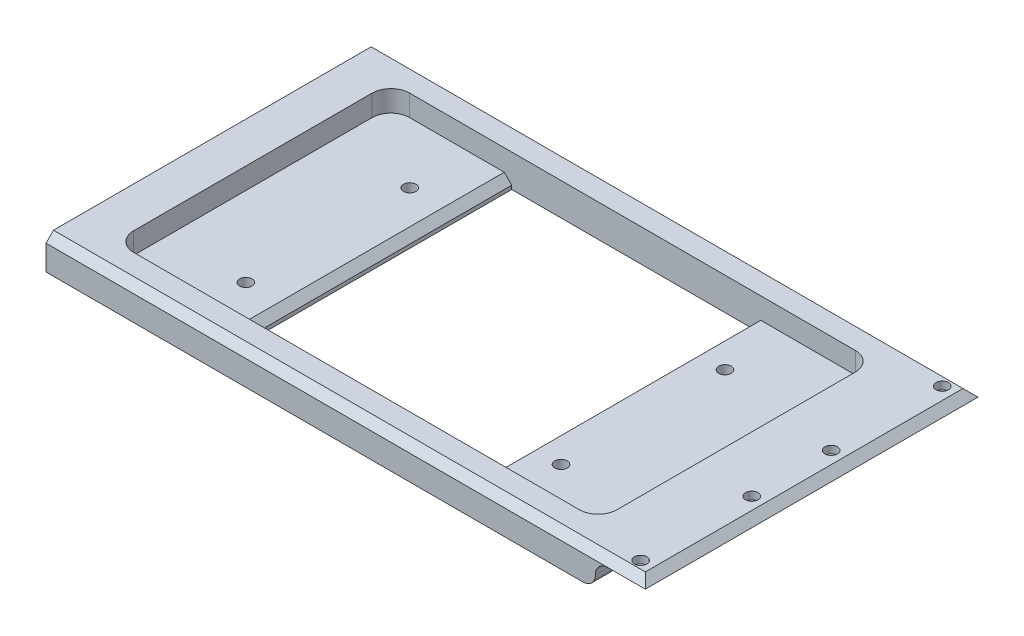
ISO-10303-21;
HEADER;
FILE_DESCRIPTION(('STEP AP214'),'2;1');
FILE_NAME('part.step','',(''),(''),'','','');
FILE_SCHEMA(('AUTOMOTIVE_DESIGN { 1 0 10303 214 1 1 1 1 }'));
ENDSEC;
DATA;
#1=APPLICATION_CONTEXT('core data for automotive mechanical design processes');
#2=APPLICATION_PROTOCOL_DEFINITION('international standard','automotive_design',2000,#1);
#3=PRODUCT_CONTEXT('',#1,'mechanical');
#4=PRODUCT('Part','Part','',(#3));
#5=PRODUCT_RELATED_PRODUCT_CATEGORY('part','',(#4));
#6=PRODUCT_DEFINITION_FORMATION('','',#4);
#7=PRODUCT_DEFINITION_CONTEXT('part definition',#1,'design');
#8=PRODUCT_DEFINITION('design','',#6,#7);
#9=PRODUCT_DEFINITION_SHAPE('','',#8);
#10=(LENGTH_UNIT() NAMED_UNIT(*) SI_UNIT(.MILLI.,.METRE.));
#11=(NAMED_UNIT(*) PLANE_ANGLE_UNIT() SI_UNIT($,.RADIAN.));
#12=(NAMED_UNIT(*) SI_UNIT($,.STERADIAN.) SOLID_ANGLE_UNIT());
#13=UNCERTAINTY_MEASURE_WITH_UNIT(LENGTH_MEASURE(1.E-05),#10,'distance_accuracy_value','');
#14=(GEOMETRIC_REPRESENTATION_CONTEXT(3) GLOBAL_UNCERTAINTY_ASSIGNED_CONTEXT((#13)) GLOBAL_UNIT_ASSIGNED_CONTEXT((#10,
#11,#12)) REPRESENTATION_CONTEXT('',''));
#15=CARTESIAN_POINT('',(0.,0.,0.));
#16=DIRECTION('',(0.,0.,1.));
#17=DIRECTION('',(1.,0.,0.));
#18=AXIS2_PLACEMENT_3D('',#15,#16,#17);
#19=CARTESIAN_POINT('',(-89.25,4.5,47.75));
#20=DIRECTION('',(0.,1.,0.));
#21=DIRECTION('',(0.,0.,1.));
#22=AXIS2_PLACEMENT_3D('',#19,#20,#21);
#23=PLANE('',#22);
#24=DIRECTION('',(-1.,0.,0.));
#25=VECTOR('',#24,1.);
#26=CARTESIAN_POINT('',(-89.25,4.5,-55.25));
#27=LINE('',#26,#25);
#28=CARTESIAN_POINT('',(89.25,4.5,-55.25));
#29=VERTEX_POINT('',#28);
#30=CARTESIAN_POINT('',(51.3518438840057,4.5,-55.25));
#31=VERTEX_POINT('',#30);
#32=EDGE_CURVE('E328',#29,#31,#27,.T.);
#33=ORIENTED_EDGE('',*,*,#32,.T.);
#34=DIRECTION('',(0.,0.,1.));
#35=VECTOR('',#34,1.);
#36=CARTESIAN_POINT('',(51.3518438840057,4.5,55.25));
#37=LINE('',#36,#35);
#38=CARTESIAN_POINT('',(51.3518438840057,4.5,55.25));
#39=VERTEX_POINT('',#38);
#40=EDGE_CURVE('E457',#31,#39,#37,.T.);
#41=ORIENTED_EDGE('',*,*,#40,.T.);
#42=DIRECTION('',(1.,0.,0.));
#43=VECTOR('',#42,1.);
#44=CARTESIAN_POINT('',(-89.25,4.5,55.25));
#45=LINE('',#44,#43);
#46=CARTESIAN_POINT('',(89.25,4.5,55.25));
#47=VERTEX_POINT('',#46);
#48=EDGE_CURVE('E309',#39,#47,#45,.T.);
#49=ORIENTED_EDGE('',*,*,#48,.T.);
#50=CARTESIAN_POINT('',(89.25,4.5,47.75));
#51=DIRECTION('',(0.,1.,0.));
#52=DIRECTION('',(0.,0.,1.));
#53=AXIS2_PLACEMENT_3D('',#50,#51,#52);
#54=CIRCLE('',#53,7.50000000000001);
#55=CARTESIAN_POINT('',(96.75,4.5,47.75));
#56=VERTEX_POINT('',#55);
#57=EDGE_CURVE('E315',#47,#56,#54,.T.);
#58=ORIENTED_EDGE('',*,*,#57,.T.);
#59=DIRECTION('',(0.,0.,-1.));
#60=VECTOR('',#59,1.);
#61=CARTESIAN_POINT('',(96.75,4.5,-47.75));
#62=LINE('',#61,#60);
#63=CARTESIAN_POINT('',(96.75,4.5,-47.75));
#64=VERTEX_POINT('',#63);
#65=EDGE_CURVE('E319',#56,#64,#62,.T.);
#66=ORIENTED_EDGE('',*,*,#65,.T.);
#67=CARTESIAN_POINT('',(89.25,4.5,-47.75));
#68=DIRECTION('',(0.,1.,0.));
#69=DIRECTION('',(0.,0.,-1.));
#70=AXIS2_PLACEMENT_3D('',#67,#68,#69);
#71=CIRCLE('',#70,7.5);
#72=EDGE_CURVE('E323',#64,#29,#71,.T.);
#73=ORIENTED_EDGE('',*,*,#72,.T.);
#74=EDGE_LOOP('',(#33,#41,#49,#58,#66,#73));
#75=FACE_BOUND('',#74,.T.);
#76=CARTESIAN_POINT('',(61.34,4.5,34.72));
#77=DIRECTION('',(0.,1.,0.));
#78=DIRECTION('',(0.,0.,1.));
#79=AXIS2_PLACEMENT_3D('',#76,#77,#78);
#80=CIRCLE('',#79,2.49999999999999);
#81=CARTESIAN_POINT('',(61.34,4.5,37.22));
#82=VERTEX_POINT('',#81);
#83=EDGE_CURVE('E288',#82,#82,#80,.T.);
#84=ORIENTED_EDGE('',*,*,#83,.F.);
#85=EDGE_LOOP('',(#84));
#86=FACE_BOUND('',#85,.T.);
#87=CARTESIAN_POINT('',(61.34,4.5,-30.93));
#88=DIRECTION('',(0.,1.,0.));
#89=DIRECTION('',(0.,0.,1.));
#90=AXIS2_PLACEMENT_3D('',#87,#88,#89);
#91=CIRCLE('',#90,2.49999999999999);
#92=CARTESIAN_POINT('',(61.34,4.5,-28.43));
#93=VERTEX_POINT('',#92);
#94=EDGE_CURVE('E280',#93,#93,#91,.T.);
#95=ORIENTED_EDGE('',*,*,#94,.F.);
#96=EDGE_LOOP('',(#95));
#97=FACE_BOUND('',#96,.T.);
#98=ADVANCED_FACE('F57',(#75,#86,#97),#23,.T.);
#99=CARTESIAN_POINT('',(-113.,13.,-66.6));
#100=DIRECTION('',(1.,0.,0.));
#101=DIRECTION('',(0.,0.,-1.));
#102=AXIS2_PLACEMENT_3D('',#99,#100,#101);
#103=PLANE('',#102);
#104=DIRECTION('',(0.,-1.,0.));
#105=VECTOR('',#104,1.);
#106=CARTESIAN_POINT('',(-113.,13.,66.6));
#107=LINE('',#106,#105);
#108=CARTESIAN_POINT('',(-113.,10.,66.6));
#109=VERTEX_POINT('',#108);
#110=CARTESIAN_POINT('',(-113.,0.,66.6));
#111=VERTEX_POINT('',#110);
#112=EDGE_CURVE('E413',#109,#111,#107,.T.);
#113=ORIENTED_EDGE('',*,*,#112,.F.);
#114=DIRECTION('',(0.,0.707106781186547,-0.707106781186547));
#115=VECTOR('',#114,1.);
#116=CARTESIAN_POINT('',(-113.,13.,63.6));
#117=LINE('',#116,#115);
#118=CARTESIAN_POINT('',(-113.,13.,63.6));
#119=VERTEX_POINT('',#118);
#120=EDGE_CURVE('E480',#109,#119,#117,.T.);
#121=ORIENTED_EDGE('',*,*,#120,.T.);
#122=DIRECTION('',(0.,0.,1.));
#123=VECTOR('',#122,1.);
#124=CARTESIAN_POINT('',(-113.,13.,-66.6));
#125=LINE('',#124,#123);
#126=CARTESIAN_POINT('',(-113.,13.,-63.6));
#127=VERTEX_POINT('',#126);
#128=EDGE_CURVE('E395',#127,#119,#125,.T.);
#129=ORIENTED_EDGE('',*,*,#128,.F.);
#130=DIRECTION('',(0.,-0.707106781186547,-0.707106781186547));
#131=VECTOR('',#130,1.);
#132=CARTESIAN_POINT('',(-113.,13.,-63.6));
#133=LINE('',#132,#131);
#134=CARTESIAN_POINT('',(-113.,10.,-66.6));
#135=VERTEX_POINT('',#134);
#136=EDGE_CURVE('E76',#127,#135,#133,.T.);
#137=ORIENTED_EDGE('',*,*,#136,.T.);
#138=DIRECTION('',(0.,-1.,0.));
#139=VECTOR('',#138,1.);
#140=CARTESIAN_POINT('',(-113.,13.,-66.6));
#141=LINE('',#140,#139);
#142=CARTESIAN_POINT('',(-113.,0.,-66.6));
#143=VERTEX_POINT('',#142);
#144=EDGE_CURVE('E399',#135,#143,#141,.T.);
#145=ORIENTED_EDGE('',*,*,#144,.T.);
#146=DIRECTION('',(0.,0.,1.));
#147=VECTOR('',#146,1.);
#148=CARTESIAN_POINT('',(-113.,0.,-66.6));
#149=LINE('',#148,#147);
#150=EDGE_CURVE('E373',#143,#111,#149,.T.);
#151=ORIENTED_EDGE('',*,*,#150,.T.);
#152=EDGE_LOOP('',(#113,#121,#129,#137,#145,#151));
#153=FACE_BOUND('',#152,.T.);
#154=ADVANCED_FACE('F500',(#153),#103,.F.);
#155=CARTESIAN_POINT('',(-113.,13.,66.6));
#156=DIRECTION('',(0.,0.,-1.));
#157=DIRECTION('',(-1.,0.,0.));
#158=AXIS2_PLACEMENT_3D('',#155,#156,#157);
#159=PLANE('',#158);
#160=CARTESIAN_POINT('',(112.,5.,66.6));
#161=DIRECTION('',(0.,0.,-1.));
#162=DIRECTION('',(-1.,0.,0.));
#163=AXIS2_PLACEMENT_3D('',#160,#161,#162);
#164=CIRCLE('',#163,5.);
#165=CARTESIAN_POINT('',(107.,5.,66.6));
#166=VERTEX_POINT('',#165);
#167=CARTESIAN_POINT('',(112.,10.,66.6));
#168=VERTEX_POINT('',#167);
#169=EDGE_CURVE('E431',#166,#168,#164,.T.);
#170=ORIENTED_EDGE('',*,*,#169,.T.);
#171=DIRECTION('',(-1.,0.,0.));
#172=VECTOR('',#171,1.);
#173=CARTESIAN_POINT('',(-113.,10.,66.6));
#174=LINE('',#173,#172);
#175=EDGE_CURVE('E84',#168,#109,#174,.T.);
#176=ORIENTED_EDGE('',*,*,#175,.T.);
#177=ORIENTED_EDGE('',*,*,#112,.T.);
#178=DIRECTION('',(1.,0.,0.));
#179=VECTOR('',#178,1.);
#180=CARTESIAN_POINT('',(-113.,0.,66.6));
#181=LINE('',#180,#179);
#182=CARTESIAN_POINT('',(102.,0.,66.6));
#183=VERTEX_POINT('',#182);
#184=EDGE_CURVE('E404',#111,#183,#181,.T.);
#185=ORIENTED_EDGE('',*,*,#184,.T.);
#186=CARTESIAN_POINT('',(102.,5.,66.6));
#187=DIRECTION('',(0.,0.,-1.));
#188=DIRECTION('',(-1.,0.,0.));
#189=AXIS2_PLACEMENT_3D('',#186,#187,#188);
#190=CIRCLE('',#189,5.);
#191=EDGE_CURVE('E423',#183,#166,#190,.F.);
#192=ORIENTED_EDGE('',*,*,#191,.T.);
#193=EDGE_LOOP('',(#170,#176,#177,#185,#192));
#194=FACE_BOUND('',#193,.T.);
#195=ADVANCED_FACE('F510',(#194),#159,.F.);
#196=CARTESIAN_POINT('',(-113.,13.,-66.6));
#197=DIRECTION('',(0.,0.,1.));
#198=DIRECTION('',(1.,0.,0.));
#199=AXIS2_PLACEMENT_3D('',#196,#197,#198);
#200=PLANE('',#199);
#201=ORIENTED_EDGE('',*,*,#144,.F.);
#202=DIRECTION('',(1.,0.,0.));
#203=VECTOR('',#202,1.);
#204=CARTESIAN_POINT('',(127.,10.,-66.6));
#205=LINE('',#204,#203);
#206=CARTESIAN_POINT('',(112.,10.,-66.6));
#207=VERTEX_POINT('',#206);
#208=EDGE_CURVE('E483',#135,#207,#205,.T.);
#209=ORIENTED_EDGE('',*,*,#208,.T.);
#210=CARTESIAN_POINT('',(112.,5.,-66.6));
#211=DIRECTION('',(0.,0.,1.));
#212=DIRECTION('',(1.,0.,0.));
#213=AXIS2_PLACEMENT_3D('',#210,#211,#212);
#214=CIRCLE('',#213,5.);
#215=CARTESIAN_POINT('',(107.,5.,-66.6));
#216=VERTEX_POINT('',#215);
#217=EDGE_CURVE('E428',#207,#216,#214,.T.);
#218=ORIENTED_EDGE('',*,*,#217,.T.);
#219=CARTESIAN_POINT('',(102.,5.,-66.6));
#220=DIRECTION('',(0.,0.,1.));
#221=DIRECTION('',(1.,0.,0.));
#222=AXIS2_PLACEMENT_3D('',#219,#220,#221);
#223=CIRCLE('',#222,5.);
#224=CARTESIAN_POINT('',(102.,0.,-66.6));
#225=VERTEX_POINT('',#224);
#226=EDGE_CURVE('E416',#216,#225,#223,.F.);
#227=ORIENTED_EDGE('',*,*,#226,.T.);
#228=DIRECTION('',(-1.,0.,0.));
#229=VECTOR('',#228,1.);
#230=CARTESIAN_POINT('',(-113.,0.,-66.6));
#231=LINE('',#230,#229);
#232=EDGE_CURVE('E400',#225,#143,#231,.T.);
#233=ORIENTED_EDGE('',*,*,#232,.T.);
#234=EDGE_LOOP('',(#201,#209,#218,#227,#233));
#235=FACE_BOUND('',#234,.T.);
#236=ADVANCED_FACE('F502',(#235),#200,.F.);
#237=CARTESIAN_POINT('',(0.,13.,0.));
#238=DIRECTION('',(0.,1.,0.));
#239=DIRECTION('',(0.,0.,1.));
#240=AXIS2_PLACEMENT_3D('',#237,#238,#239);
#241=PLANE('',#240);
#242=CARTESIAN_POINT('',(119.05,13.,-60.25));
#243=DIRECTION('',(0.,1.,0.));
#244=DIRECTION('',(0.,0.,1.));
#245=AXIS2_PLACEMENT_3D('',#242,#243,#244);
#246=CIRCLE('',#245,2.5);
#247=CARTESIAN_POINT('',(119.05,13.,-57.75));
#248=VERTEX_POINT('',#247);
#249=EDGE_CURVE('E231',#248,#248,#246,.T.);
#250=ORIENTED_EDGE('',*,*,#249,.F.);
#251=EDGE_LOOP('',(#250));
#252=FACE_BOUND('',#251,.T.);
#253=CARTESIAN_POINT('',(119.05,13.,-15.75));
#254=DIRECTION('',(0.,1.,0.));
#255=DIRECTION('',(0.,0.,1.));
#256=AXIS2_PLACEMENT_3D('',#253,#254,#255);
#257=CIRCLE('',#256,2.5);
#258=CARTESIAN_POINT('',(119.05,13.,-13.25));
#259=VERTEX_POINT('',#258);
#260=EDGE_CURVE('E453',#259,#259,#257,.T.);
#261=ORIENTED_EDGE('',*,*,#260,.F.);
#262=EDGE_LOOP('',(#261));
#263=FACE_BOUND('',#262,.T.);
#264=CARTESIAN_POINT('',(119.05,13.,16.05));
#265=DIRECTION('',(0.,1.,0.));
#266=DIRECTION('',(0.,0.,1.));
#267=AXIS2_PLACEMENT_3D('',#264,#265,#266);
#268=CIRCLE('',#267,2.5);
#269=CARTESIAN_POINT('',(119.05,13.,18.55));
#270=VERTEX_POINT('',#269);
#271=EDGE_CURVE('E448',#270,#270,#268,.T.);
#272=ORIENTED_EDGE('',*,*,#271,.F.);
#273=EDGE_LOOP('',(#272));
#274=FACE_BOUND('',#273,.T.);
#275=CARTESIAN_POINT('',(119.05,13.,60.55));
#276=DIRECTION('',(0.,1.,0.));
#277=DIRECTION('',(0.,0.,1.));
#278=AXIS2_PLACEMENT_3D('',#275,#276,#277);
#279=CIRCLE('',#278,2.5);
#280=CARTESIAN_POINT('',(119.05,13.,63.05));
#281=VERTEX_POINT('',#280);
#282=EDGE_CURVE('E443',#281,#281,#279,.T.);
#283=ORIENTED_EDGE('',*,*,#282,.F.);
#284=EDGE_LOOP('',(#283));
#285=FACE_BOUND('',#284,.T.);
#286=CARTESIAN_POINT('',(-89.25,13.,47.75));
#287=DIRECTION('',(0.,1.,0.));
#288=DIRECTION('',(0.,0.,1.));
#289=AXIS2_PLACEMENT_3D('',#286,#287,#288);
#290=CIRCLE('',#289,7.49999999999999);
#291=CARTESIAN_POINT('',(-96.75,13.,47.75));
#292=VERTEX_POINT('',#291);
#293=CARTESIAN_POINT('',(-89.25,13.,55.25));
#294=VERTEX_POINT('',#293);
#295=EDGE_CURVE('E304',#292,#294,#290,.T.);
#296=ORIENTED_EDGE('',*,*,#295,.F.);
#297=DIRECTION('',(0.,0.,1.));
#298=VECTOR('',#297,1.);
#299=CARTESIAN_POINT('',(-96.75,13.,-47.75));
#300=LINE('',#299,#298);
#301=CARTESIAN_POINT('',(-96.75,13.,-47.75));
#302=VERTEX_POINT('',#301);
#303=EDGE_CURVE('E310',#302,#292,#300,.T.);
#304=ORIENTED_EDGE('',*,*,#303,.F.);
#305=CARTESIAN_POINT('',(-89.25,13.,-47.75));
#306=DIRECTION('',(0.,1.,0.));
#307=DIRECTION('',(0.,0.,1.));
#308=AXIS2_PLACEMENT_3D('',#305,#306,#307);
#309=CIRCLE('',#308,7.5);
#310=CARTESIAN_POINT('',(-89.25,13.,-55.25));
#311=VERTEX_POINT('',#310);
#312=EDGE_CURVE('E363',#311,#302,#309,.T.);
#313=ORIENTED_EDGE('',*,*,#312,.F.);
#314=DIRECTION('',(-1.,0.,0.));
#315=VECTOR('',#314,1.);
#316=CARTESIAN_POINT('',(-89.25,13.,-55.25));
#317=LINE('',#316,#315);
#318=CARTESIAN_POINT('',(89.25,13.,-55.25));
#319=VERTEX_POINT('',#318);
#320=EDGE_CURVE('E359',#319,#311,#317,.T.);
#321=ORIENTED_EDGE('',*,*,#320,.F.);
#322=CARTESIAN_POINT('',(89.25,13.,-47.75));
#323=DIRECTION('',(0.,1.,0.));
#324=DIRECTION('',(0.,0.,-1.));
#325=AXIS2_PLACEMENT_3D('',#322,#323,#324);
#326=CIRCLE('',#325,7.5);
#327=CARTESIAN_POINT('',(96.75,13.,-47.75));
#328=VERTEX_POINT('',#327);
#329=EDGE_CURVE('E355',#328,#319,#326,.T.);
#330=ORIENTED_EDGE('',*,*,#329,.F.);
#331=DIRECTION('',(0.,0.,-1.));
#332=VECTOR('',#331,1.);
#333=CARTESIAN_POINT('',(96.75,13.,-47.75));
#334=LINE('',#333,#332);
#335=CARTESIAN_POINT('',(96.75,13.,47.75));
#336=VERTEX_POINT('',#335);
#337=EDGE_CURVE('E351',#336,#328,#334,.T.);
#338=ORIENTED_EDGE('',*,*,#337,.F.);
#339=CARTESIAN_POINT('',(89.25,13.,47.75));
#340=DIRECTION('',(0.,1.,0.));
#341=DIRECTION('',(0.,0.,1.));
#342=AXIS2_PLACEMENT_3D('',#339,#340,#341);
#343=CIRCLE('',#342,7.50000000000001);
#344=CARTESIAN_POINT('',(89.25,13.,55.25));
#345=VERTEX_POINT('',#344);
#346=EDGE_CURVE('E347',#345,#336,#343,.T.);
#347=ORIENTED_EDGE('',*,*,#346,.F.);
#348=DIRECTION('',(1.,0.,0.));
#349=VECTOR('',#348,1.);
#350=CARTESIAN_POINT('',(-89.25,13.,55.25));
#351=LINE('',#350,#349);
#352=EDGE_CURVE('E343',#294,#345,#351,.T.);
#353=ORIENTED_EDGE('',*,*,#352,.F.);
#354=EDGE_LOOP('',(#296,#304,#313,#321,#330,#338,#347,#353));
#355=FACE_BOUND('',#354,.T.);
#356=ORIENTED_EDGE('',*,*,#128,.T.);
#357=DIRECTION('',(1.,0.,0.));
#358=VECTOR('',#357,1.);
#359=CARTESIAN_POINT('',(127.,13.,63.6));
#360=LINE('',#359,#358);
#361=CARTESIAN_POINT('',(124.,13.,63.6));
#362=VERTEX_POINT('',#361);
#363=EDGE_CURVE('E472',#119,#362,#360,.T.);
#364=ORIENTED_EDGE('',*,*,#363,.T.);
#365=DIRECTION('',(0.,0.,-1.));
#366=VECTOR('',#365,1.);
#367=CARTESIAN_POINT('',(124.,13.,-66.6));
#368=LINE('',#367,#366);
#369=CARTESIAN_POINT('',(124.,13.,-63.6));
#370=VERTEX_POINT('',#369);
#371=EDGE_CURVE('E469',#362,#370,#368,.T.);
#372=ORIENTED_EDGE('',*,*,#371,.T.);
#373=DIRECTION('',(-1.,0.,0.));
#374=VECTOR('',#373,1.);
#375=CARTESIAN_POINT('',(-113.,13.,-63.6));
#376=LINE('',#375,#374);
#377=EDGE_CURVE('E227',#370,#127,#376,.T.);
#378=ORIENTED_EDGE('',*,*,#377,.T.);
#379=EDGE_LOOP('',(#356,#364,#372,#378));
#380=FACE_BOUND('',#379,.T.);
#381=ADVANCED_FACE('F499',(#252,#263,#274,#285,#355,#380),#241,.T.);
#382=CARTESIAN_POINT('',(0.,0.,0.));
#383=DIRECTION('',(0.,1.,0.));
#384=DIRECTION('',(0.,0.,1.));
#385=AXIS2_PLACEMENT_3D('',#382,#383,#384);
#386=PLANE('',#385);
#387=DIRECTION('',(1.,0.,0.));
#388=VECTOR('',#387,1.);
#389=CARTESIAN_POINT('',(-48.3518438840057,0.,55.25));
#390=LINE('',#389,#388);
#391=CARTESIAN_POINT('',(-48.3518438840057,0.,55.25));
#392=VERTEX_POINT('',#391);
#393=CARTESIAN_POINT('',(48.3518438840057,0.,55.25));
#394=VERTEX_POINT('',#393);
#395=EDGE_CURVE('E252',#392,#394,#390,.T.);
#396=ORIENTED_EDGE('',*,*,#395,.T.);
#397=DIRECTION('',(0.,0.,-1.));
#398=VECTOR('',#397,1.);
#399=CARTESIAN_POINT('',(48.3518438840057,0.,-55.25));
#400=LINE('',#399,#398);
#401=CARTESIAN_POINT('',(48.3518438840057,0.,-55.25));
#402=VERTEX_POINT('',#401);
#403=EDGE_CURVE('E236',#394,#402,#400,.T.);
#404=ORIENTED_EDGE('',*,*,#403,.T.);
#405=DIRECTION('',(-1.,0.,0.));
#406=VECTOR('',#405,1.);
#407=CARTESIAN_POINT('',(-48.3518438840057,0.,-55.25));
#408=LINE('',#407,#406);
#409=CARTESIAN_POINT('',(-48.3518438840057,0.,-55.25));
#410=VERTEX_POINT('',#409);
#411=EDGE_CURVE('E240',#402,#410,#408,.T.);
#412=ORIENTED_EDGE('',*,*,#411,.T.);
#413=DIRECTION('',(0.,0.,1.));
#414=VECTOR('',#413,1.);
#415=CARTESIAN_POINT('',(-48.3518438840057,0.,-55.25));
#416=LINE('',#415,#414);
#417=EDGE_CURVE('E248',#410,#392,#416,.T.);
#418=ORIENTED_EDGE('',*,*,#417,.T.);
#419=EDGE_LOOP('',(#396,#404,#412,#418));
#420=FACE_BOUND('',#419,.T.);
#421=CARTESIAN_POINT('',(-64.86,0.,-30.93));
#422=DIRECTION('',(0.,1.,0.));
#423=DIRECTION('',(0.,0.,1.));
#424=AXIS2_PLACEMENT_3D('',#421,#422,#423);
#425=CIRCLE('',#424,2.49999999999999);
#426=CARTESIAN_POINT('',(-64.86,0.,-28.43));
#427=VERTEX_POINT('',#426);
#428=EDGE_CURVE('E276',#427,#427,#425,.T.);
#429=ORIENTED_EDGE('',*,*,#428,.T.);
#430=EDGE_LOOP('',(#429));
#431=FACE_BOUND('',#430,.T.);
#432=CARTESIAN_POINT('',(61.34,0.,-30.93));
#433=DIRECTION('',(0.,1.,0.));
#434=DIRECTION('',(0.,0.,1.));
#435=AXIS2_PLACEMENT_3D('',#432,#433,#434);
#436=CIRCLE('',#435,2.49999999999999);
#437=CARTESIAN_POINT('',(61.34,0.,-28.43));
#438=VERTEX_POINT('',#437);
#439=EDGE_CURVE('E284',#438,#438,#436,.T.);
#440=ORIENTED_EDGE('',*,*,#439,.T.);
#441=EDGE_LOOP('',(#440));
#442=FACE_BOUND('',#441,.T.);
#443=CARTESIAN_POINT('',(61.34,0.,34.72));
#444=DIRECTION('',(0.,1.,0.));
#445=DIRECTION('',(0.,0.,1.));
#446=AXIS2_PLACEMENT_3D('',#443,#444,#445);
#447=CIRCLE('',#446,2.49999999999999);
#448=CARTESIAN_POINT('',(61.34,0.,37.22));
#449=VERTEX_POINT('',#448);
#450=EDGE_CURVE('E292',#449,#449,#447,.T.);
#451=ORIENTED_EDGE('',*,*,#450,.T.);
#452=EDGE_LOOP('',(#451));
#453=FACE_BOUND('',#452,.T.);
#454=CARTESIAN_POINT('',(-64.86,0.,34.72));
#455=DIRECTION('',(0.,1.,0.));
#456=DIRECTION('',(0.,0.,1.));
#457=AXIS2_PLACEMENT_3D('',#454,#455,#456);
#458=CIRCLE('',#457,2.49999999999999);
#459=CARTESIAN_POINT('',(-64.86,0.,37.22));
#460=VERTEX_POINT('',#459);
#461=EDGE_CURVE('E300',#460,#460,#458,.T.);
#462=ORIENTED_EDGE('',*,*,#461,.T.);
#463=EDGE_LOOP('',(#462));
#464=FACE_BOUND('',#463,.T.);
#465=ORIENTED_EDGE('',*,*,#232,.F.);
#466=DIRECTION('',(0.,0.,-1.));
#467=VECTOR('',#466,1.);
#468=CARTESIAN_POINT('',(102.,0.,0.));
#469=LINE('',#468,#467);
#470=EDGE_CURVE('E419',#225,#183,#469,.F.);
#471=ORIENTED_EDGE('',*,*,#470,.T.);
#472=ORIENTED_EDGE('',*,*,#184,.F.);
#473=ORIENTED_EDGE('',*,*,#150,.F.);
#474=EDGE_LOOP('',(#465,#471,#472,#473));
#475=FACE_BOUND('',#474,.T.);
#476=ADVANCED_FACE('F508',(#420,#431,#442,#453,#464,#475),#386,.F.);
#477=CARTESIAN_POINT('',(-89.25,4.5,47.75));
#478=DIRECTION('',(0.,1.,0.));
#479=DIRECTION('',(0.,0.,1.));
#480=AXIS2_PLACEMENT_3D('',#477,#478,#479);
#481=CYLINDRICAL_SURFACE('',#480,7.49999999999999);
#482=ORIENTED_EDGE('',*,*,#295,.T.);
#483=DIRECTION('',(0.,1.,0.));
#484=VECTOR('',#483,1.);
#485=CARTESIAN_POINT('',(-89.25,4.5,55.25));
#486=LINE('',#485,#484);
#487=CARTESIAN_POINT('',(-89.25,4.5,55.25));
#488=VERTEX_POINT('',#487);
#489=EDGE_CURVE('E340',#488,#294,#486,.T.);
#490=ORIENTED_EDGE('',*,*,#489,.F.);
#491=CARTESIAN_POINT('',(-89.25,4.5,47.75));
#492=DIRECTION('',(0.,1.,0.));
#493=DIRECTION('',(0.,0.,1.));
#494=AXIS2_PLACEMENT_3D('',#491,#492,#493);
#495=CIRCLE('',#494,7.49999999999999);
#496=CARTESIAN_POINT('',(-96.75,4.5,47.75));
#497=VERTEX_POINT('',#496);
#498=EDGE_CURVE('E305',#497,#488,#495,.T.);
#499=ORIENTED_EDGE('',*,*,#498,.F.);
#500=DIRECTION('',(0.,1.,0.));
#501=VECTOR('',#500,1.);
#502=CARTESIAN_POINT('',(-96.75,4.5,47.75));
#503=LINE('',#502,#501);
#504=EDGE_CURVE('E370',#497,#292,#503,.T.);
#505=ORIENTED_EDGE('',*,*,#504,.T.);
#506=EDGE_LOOP('',(#482,#490,#499,#505));
#507=FACE_BOUND('',#506,.T.);
#508=ADVANCED_FACE('F565',(#507),#481,.F.);
#509=CARTESIAN_POINT('',(-96.75,4.5,-47.75));
#510=DIRECTION('',(-1.,0.,0.));
#511=DIRECTION('',(0.,0.,1.));
#512=AXIS2_PLACEMENT_3D('',#509,#510,#511);
#513=PLANE('',#512);
#514=ORIENTED_EDGE('',*,*,#303,.T.);
#515=ORIENTED_EDGE('',*,*,#504,.F.);
#516=DIRECTION('',(0.,0.,1.));
#517=VECTOR('',#516,1.);
#518=CARTESIAN_POINT('',(-96.75,4.5,-47.75));
#519=LINE('',#518,#517);
#520=CARTESIAN_POINT('',(-96.75,4.5,-47.75));
#521=VERTEX_POINT('',#520);
#522=EDGE_CURVE('E336',#521,#497,#519,.T.);
#523=ORIENTED_EDGE('',*,*,#522,.F.);
#524=DIRECTION('',(0.,1.,0.));
#525=VECTOR('',#524,1.);
#526=CARTESIAN_POINT('',(-96.75,4.5,-47.75));
#527=LINE('',#526,#525);
#528=EDGE_CURVE('E374',#521,#302,#527,.T.);
#529=ORIENTED_EDGE('',*,*,#528,.T.);
#530=EDGE_LOOP('',(#514,#515,#523,#529));
#531=FACE_BOUND('',#530,.T.);
#532=ADVANCED_FACE('F572',(#531),#513,.F.);
#533=CARTESIAN_POINT('',(-89.25,4.5,-47.75));
#534=DIRECTION('',(0.,1.,0.));
#535=DIRECTION('',(0.,0.,1.));
#536=AXIS2_PLACEMENT_3D('',#533,#534,#535);
#537=CYLINDRICAL_SURFACE('',#536,7.5);
#538=ORIENTED_EDGE('',*,*,#312,.T.);
#539=ORIENTED_EDGE('',*,*,#528,.F.);
#540=CARTESIAN_POINT('',(-89.25,4.5,-47.75));
#541=DIRECTION('',(0.,1.,0.));
#542=DIRECTION('',(0.,0.,1.));
#543=AXIS2_PLACEMENT_3D('',#540,#541,#542);
#544=CIRCLE('',#543,7.5);
#545=CARTESIAN_POINT('',(-89.25,4.5,-55.25));
#546=VERTEX_POINT('',#545);
#547=EDGE_CURVE('E332',#546,#521,#544,.T.);
#548=ORIENTED_EDGE('',*,*,#547,.F.);
#549=DIRECTION('',(0.,1.,0.));
#550=VECTOR('',#549,1.);
#551=CARTESIAN_POINT('',(-89.25,4.5,-55.25));
#552=LINE('',#551,#550);
#553=EDGE_CURVE('E377',#546,#311,#552,.T.);
#554=ORIENTED_EDGE('',*,*,#553,.T.);
#555=EDGE_LOOP('',(#538,#539,#548,#554));
#556=FACE_BOUND('',#555,.T.);
#557=ADVANCED_FACE('F607',(#556),#537,.F.);
#558=CARTESIAN_POINT('',(-89.25,4.5,-55.25));
#559=DIRECTION('',(0.,0.,-1.));
#560=DIRECTION('',(-1.,0.,0.));
#561=AXIS2_PLACEMENT_3D('',#558,#559,#560);
#562=PLANE('',#561);
#563=ORIENTED_EDGE('',*,*,#320,.T.);
#564=ORIENTED_EDGE('',*,*,#553,.F.);
#565=CARTESIAN_POINT('',(-51.3518438840057,4.5,-55.25));
#566=VERTEX_POINT('',#565);
#567=EDGE_CURVE('E327',#566,#546,#27,.T.);
#568=ORIENTED_EDGE('',*,*,#567,.F.);
#569=DIRECTION('',(0.707106781186548,-0.707106781186548,0.));
#570=VECTOR('',#569,1.);
#571=CARTESIAN_POINT('',(-70.3009219420029,23.4490780579971,-55.25));
#572=LINE('',#571,#570);
#573=CARTESIAN_POINT('',(-48.3518438840057,1.49999999999997,-55.25));
#574=VERTEX_POINT('',#573);
#575=EDGE_CURVE('E12',#566,#574,#572,.T.);
#576=ORIENTED_EDGE('',*,*,#575,.T.);
#577=DIRECTION('',(0.,1.,0.));
#578=VECTOR('',#577,1.);
#579=CARTESIAN_POINT('',(-48.3518438840057,0.,-55.25));
#580=LINE('',#579,#578);
#581=EDGE_CURVE('E266',#410,#574,#580,.T.);
#582=ORIENTED_EDGE('',*,*,#581,.F.);
#583=ORIENTED_EDGE('',*,*,#411,.F.);
#584=DIRECTION('',(0.,1.,0.));
#585=VECTOR('',#584,1.);
#586=CARTESIAN_POINT('',(48.3518438840057,0.,-55.25));
#587=LINE('',#586,#585);
#588=CARTESIAN_POINT('',(48.3518438840057,1.49999999999997,-55.25));
#589=VERTEX_POINT('',#588);
#590=EDGE_CURVE('E256',#402,#589,#587,.T.);
#591=ORIENTED_EDGE('',*,*,#590,.T.);
#592=DIRECTION('',(0.707106781186547,0.707106781186548,0.));
#593=VECTOR('',#592,1.);
#594=CARTESIAN_POINT('',(-18.949078057997,-65.8009219420029,-55.25));
#595=LINE('',#594,#593);
#596=EDGE_CURVE('E486',#589,#31,#595,.T.);
#597=ORIENTED_EDGE('',*,*,#596,.T.);
#598=ORIENTED_EDGE('',*,*,#32,.F.);
#599=DIRECTION('',(0.,1.,0.));
#600=VECTOR('',#599,1.);
#601=CARTESIAN_POINT('',(89.25,4.5,-55.25));
#602=LINE('',#601,#600);
#603=EDGE_CURVE('E380',#29,#319,#602,.T.);
#604=ORIENTED_EDGE('',*,*,#603,.T.);
#605=EDGE_LOOP('',(#563,#564,#568,#576,#582,#583,#591,#597,#598,#604));
#606=FACE_BOUND('',#605,.T.);
#607=ADVANCED_FACE('F603',(#606),#562,.F.);
#608=CARTESIAN_POINT('',(89.25,4.5,-47.75));
#609=DIRECTION('',(0.,1.,0.));
#610=DIRECTION('',(0.,0.,1.));
#611=AXIS2_PLACEMENT_3D('',#608,#609,#610);
#612=CYLINDRICAL_SURFACE('',#611,7.5);
#613=ORIENTED_EDGE('',*,*,#329,.T.);
#614=ORIENTED_EDGE('',*,*,#603,.F.);
#615=ORIENTED_EDGE('',*,*,#72,.F.);
#616=DIRECTION('',(0.,1.,0.));
#617=VECTOR('',#616,1.);
#618=CARTESIAN_POINT('',(96.75,4.5,-47.75));
#619=LINE('',#618,#617);
#620=EDGE_CURVE('E383',#64,#328,#619,.T.);
#621=ORIENTED_EDGE('',*,*,#620,.T.);
#622=EDGE_LOOP('',(#613,#614,#615,#621));
#623=FACE_BOUND('',#622,.T.);
#624=ADVANCED_FACE('F606',(#623),#612,.F.);
#625=CARTESIAN_POINT('',(96.75,4.5,-47.75));
#626=DIRECTION('',(1.,0.,0.));
#627=DIRECTION('',(0.,0.,-1.));
#628=AXIS2_PLACEMENT_3D('',#625,#626,#627);
#629=PLANE('',#628);
#630=ORIENTED_EDGE('',*,*,#337,.T.);
#631=ORIENTED_EDGE('',*,*,#620,.F.);
#632=ORIENTED_EDGE('',*,*,#65,.F.);
#633=DIRECTION('',(0.,1.,0.));
#634=VECTOR('',#633,1.);
#635=CARTESIAN_POINT('',(96.75,4.5,47.75));
#636=LINE('',#635,#634);
#637=EDGE_CURVE('E386',#56,#336,#636,.T.);
#638=ORIENTED_EDGE('',*,*,#637,.T.);
#639=EDGE_LOOP('',(#630,#631,#632,#638));
#640=FACE_BOUND('',#639,.T.);
#641=ADVANCED_FACE('F794',(#640),#629,.F.);
#642=CARTESIAN_POINT('',(89.25,4.5,47.75));
#643=DIRECTION('',(0.,1.,0.));
#644=DIRECTION('',(0.,0.,1.));
#645=AXIS2_PLACEMENT_3D('',#642,#643,#644);
#646=CYLINDRICAL_SURFACE('',#645,7.50000000000001);
#647=ORIENTED_EDGE('',*,*,#346,.T.);
#648=ORIENTED_EDGE('',*,*,#637,.F.);
#649=ORIENTED_EDGE('',*,*,#57,.F.);
#650=DIRECTION('',(0.,1.,0.));
#651=VECTOR('',#650,1.);
#652=CARTESIAN_POINT('',(89.25,4.5,55.25));
#653=LINE('',#652,#651);
#654=EDGE_CURVE('E389',#47,#345,#653,.T.);
#655=ORIENTED_EDGE('',*,*,#654,.T.);
#656=EDGE_LOOP('',(#647,#648,#649,#655));
#657=FACE_BOUND('',#656,.T.);
#658=ADVANCED_FACE('F553',(#657),#646,.F.);
#659=CARTESIAN_POINT('',(-89.25,4.5,55.25));
#660=DIRECTION('',(0.,0.,1.));
#661=DIRECTION('',(1.,0.,0.));
#662=AXIS2_PLACEMENT_3D('',#659,#660,#661);
#663=PLANE('',#662);
#664=ORIENTED_EDGE('',*,*,#352,.T.);
#665=ORIENTED_EDGE('',*,*,#654,.F.);
#666=ORIENTED_EDGE('',*,*,#48,.F.);
#667=DIRECTION('',(-0.707106781186547,-0.707106781186548,0.));
#668=VECTOR('',#667,1.);
#669=CARTESIAN_POINT('',(-18.949078057997,-65.8009219420029,55.25));
#670=LINE('',#669,#668);
#671=CARTESIAN_POINT('',(48.3518438840057,1.49999999999997,55.25));
#672=VERTEX_POINT('',#671);
#673=EDGE_CURVE('E489',#39,#672,#670,.T.);
#674=ORIENTED_EDGE('',*,*,#673,.T.);
#675=DIRECTION('',(0.,1.,0.));
#676=VECTOR('',#675,1.);
#677=CARTESIAN_POINT('',(48.3518438840057,0.,55.25));
#678=LINE('',#677,#676);
#679=EDGE_CURVE('E257',#394,#672,#678,.T.);
#680=ORIENTED_EDGE('',*,*,#679,.F.);
#681=ORIENTED_EDGE('',*,*,#395,.F.);
#682=DIRECTION('',(0.,1.,0.));
#683=VECTOR('',#682,1.);
#684=CARTESIAN_POINT('',(-48.3518438840057,0.,55.25));
#685=LINE('',#684,#683);
#686=CARTESIAN_POINT('',(-48.3518438840057,1.49999999999997,55.25));
#687=VERTEX_POINT('',#686);
#688=EDGE_CURVE('E262',#392,#687,#685,.T.);
#689=ORIENTED_EDGE('',*,*,#688,.T.);
#690=DIRECTION('',(-0.707106781186548,0.707106781186548,0.));
#691=VECTOR('',#690,1.);
#692=CARTESIAN_POINT('',(-70.3009219420029,23.4490780579971,55.25));
#693=LINE('',#692,#691);
#694=CARTESIAN_POINT('',(-51.3518438840057,4.5,55.25));
#695=VERTEX_POINT('',#694);
#696=EDGE_CURVE('E68',#687,#695,#693,.T.);
#697=ORIENTED_EDGE('',*,*,#696,.T.);
#698=EDGE_CURVE('E311',#488,#695,#45,.T.);
#699=ORIENTED_EDGE('',*,*,#698,.F.);
#700=ORIENTED_EDGE('',*,*,#489,.T.);
#701=EDGE_LOOP('',(#664,#665,#666,#674,#680,#681,#689,#697,#699,#700));
#702=FACE_BOUND('',#701,.T.);
#703=ADVANCED_FACE('F544',(#702),#663,.F.);
#704=ORIENTED_EDGE('',*,*,#698,.T.);
#705=DIRECTION('',(0.,0.,-1.));
#706=VECTOR('',#705,1.);
#707=CARTESIAN_POINT('',(-51.3518438840057,4.5,-55.25));
#708=LINE('',#707,#706);
#709=EDGE_CURVE('E464',#695,#566,#708,.T.);
#710=ORIENTED_EDGE('',*,*,#709,.T.);
#711=ORIENTED_EDGE('',*,*,#567,.T.);
#712=ORIENTED_EDGE('',*,*,#547,.T.);
#713=ORIENTED_EDGE('',*,*,#522,.T.);
#714=ORIENTED_EDGE('',*,*,#498,.T.);
#715=EDGE_LOOP('',(#704,#710,#711,#712,#713,#714));
#716=FACE_BOUND('',#715,.T.);
#717=CARTESIAN_POINT('',(-64.86,4.5,-30.93));
#718=DIRECTION('',(0.,1.,0.));
#719=DIRECTION('',(0.,0.,1.));
#720=AXIS2_PLACEMENT_3D('',#717,#718,#719);
#721=CIRCLE('',#720,2.49999999999999);
#722=CARTESIAN_POINT('',(-64.86,4.5,-28.43));
#723=VERTEX_POINT('',#722);
#724=EDGE_CURVE('E261',#723,#723,#721,.T.);
#725=ORIENTED_EDGE('',*,*,#724,.F.);
#726=EDGE_LOOP('',(#725));
#727=FACE_BOUND('',#726,.T.);
#728=CARTESIAN_POINT('',(-64.86,4.5,34.72));
#729=DIRECTION('',(0.,1.,0.));
#730=DIRECTION('',(0.,0.,1.));
#731=AXIS2_PLACEMENT_3D('',#728,#729,#730);
#732=CIRCLE('',#731,2.49999999999999);
#733=CARTESIAN_POINT('',(-64.86,4.5,37.22));
#734=VERTEX_POINT('',#733);
#735=EDGE_CURVE('E296',#734,#734,#732,.T.);
#736=ORIENTED_EDGE('',*,*,#735,.F.);
#737=EDGE_LOOP('',(#736));
#738=FACE_BOUND('',#737,.T.);
#739=ADVANCED_FACE('F534',(#716,#727,#738),#23,.T.);
#740=CARTESIAN_POINT('',(-64.86,4.5,34.72));
#741=DIRECTION('',(0.,1.,0.));
#742=DIRECTION('',(0.,0.,1.));
#743=AXIS2_PLACEMENT_3D('',#740,#741,#742);
#744=CYLINDRICAL_SURFACE('',#743,2.49999999999999);
#745=ORIENTED_EDGE('',*,*,#735,.T.);
#746=EDGE_LOOP('',(#745));
#747=FACE_BOUND('',#746,.T.);
#748=ORIENTED_EDGE('',*,*,#461,.F.);
#749=EDGE_LOOP('',(#748));
#750=FACE_BOUND('',#749,.T.);
#751=ADVANCED_FACE('F543',(#747,#750),#744,.F.);
#752=CARTESIAN_POINT('',(61.34,4.5,34.72));
#753=DIRECTION('',(0.,1.,0.));
#754=DIRECTION('',(0.,0.,1.));
#755=AXIS2_PLACEMENT_3D('',#752,#753,#754);
#756=CYLINDRICAL_SURFACE('',#755,2.49999999999999);
#757=ORIENTED_EDGE('',*,*,#83,.T.);
#758=EDGE_LOOP('',(#757));
#759=FACE_BOUND('',#758,.T.);
#760=ORIENTED_EDGE('',*,*,#450,.F.);
#761=EDGE_LOOP('',(#760));
#762=FACE_BOUND('',#761,.T.);
#763=ADVANCED_FACE('F551',(#759,#762),#756,.F.);
#764=CARTESIAN_POINT('',(61.34,4.5,-30.93));
#765=DIRECTION('',(0.,1.,0.));
#766=DIRECTION('',(0.,0.,1.));
#767=AXIS2_PLACEMENT_3D('',#764,#765,#766);
#768=CYLINDRICAL_SURFACE('',#767,2.49999999999999);
#769=ORIENTED_EDGE('',*,*,#94,.T.);
#770=EDGE_LOOP('',(#769));
#771=FACE_BOUND('',#770,.T.);
#772=ORIENTED_EDGE('',*,*,#439,.F.);
#773=EDGE_LOOP('',(#772));
#774=FACE_BOUND('',#773,.T.);
#775=ADVANCED_FACE('F829',(#771,#774),#768,.F.);
#776=CARTESIAN_POINT('',(-64.86,4.5,-30.93));
#777=DIRECTION('',(0.,1.,0.));
#778=DIRECTION('',(0.,0.,1.));
#779=AXIS2_PLACEMENT_3D('',#776,#777,#778);
#780=CYLINDRICAL_SURFACE('',#779,2.49999999999999);
#781=ORIENTED_EDGE('',*,*,#724,.T.);
#782=EDGE_LOOP('',(#781));
#783=FACE_BOUND('',#782,.T.);
#784=ORIENTED_EDGE('',*,*,#428,.F.);
#785=EDGE_LOOP('',(#784));
#786=FACE_BOUND('',#785,.T.);
#787=ADVANCED_FACE('F631',(#783,#786),#780,.F.);
#788=CARTESIAN_POINT('',(48.3518438840057,0.,-55.25));
#789=DIRECTION('',(1.,0.,0.));
#790=DIRECTION('',(0.,0.,-1.));
#791=AXIS2_PLACEMENT_3D('',#788,#789,#790);
#792=PLANE('',#791);
#793=ORIENTED_EDGE('',*,*,#679,.T.);
#794=DIRECTION('',(0.,0.,-1.));
#795=VECTOR('',#794,1.);
#796=CARTESIAN_POINT('',(48.3518438840057,1.49999999999997,-55.25));
#797=LINE('',#796,#795);
#798=EDGE_CURVE('E434',#672,#589,#797,.T.);
#799=ORIENTED_EDGE('',*,*,#798,.T.);
#800=ORIENTED_EDGE('',*,*,#590,.F.);
#801=ORIENTED_EDGE('',*,*,#403,.F.);
#802=EDGE_LOOP('',(#793,#799,#800,#801));
#803=FACE_BOUND('',#802,.T.);
#804=ADVANCED_FACE('F625',(#803),#792,.F.);
#805=CARTESIAN_POINT('',(-48.3518438840057,0.,-55.25));
#806=DIRECTION('',(-1.,0.,0.));
#807=DIRECTION('',(0.,0.,1.));
#808=AXIS2_PLACEMENT_3D('',#805,#806,#807);
#809=PLANE('',#808);
#810=ORIENTED_EDGE('',*,*,#581,.T.);
#811=DIRECTION('',(0.,0.,1.));
#812=VECTOR('',#811,1.);
#813=CARTESIAN_POINT('',(-48.3518438840057,1.49999999999997,55.25));
#814=LINE('',#813,#812);
#815=EDGE_CURVE('E460',#574,#687,#814,.T.);
#816=ORIENTED_EDGE('',*,*,#815,.T.);
#817=ORIENTED_EDGE('',*,*,#688,.F.);
#818=ORIENTED_EDGE('',*,*,#417,.F.);
#819=EDGE_LOOP('',(#810,#816,#817,#818));
#820=FACE_BOUND('',#819,.T.);
#821=ADVANCED_FACE('F630',(#820),#809,.F.);
#822=CARTESIAN_POINT('',(0.,10.,0.));
#823=DIRECTION('',(0.,1.,0.));
#824=DIRECTION('',(0.,0.,1.));
#825=AXIS2_PLACEMENT_3D('',#822,#823,#824);
#826=PLANE('',#825);
#827=CARTESIAN_POINT('',(119.05,10.,-60.25));
#828=DIRECTION('',(0.,1.,0.));
#829=DIRECTION('',(0.,0.,1.));
#830=AXIS2_PLACEMENT_3D('',#827,#828,#829);
#831=CIRCLE('',#830,2.5);
#832=CARTESIAN_POINT('',(119.05,10.,-57.75));
#833=VERTEX_POINT('',#832);
#834=EDGE_CURVE('E449',#833,#833,#831,.T.);
#835=ORIENTED_EDGE('',*,*,#834,.T.);
#836=EDGE_LOOP('',(#835));
#837=FACE_BOUND('',#836,.T.);
#838=CARTESIAN_POINT('',(119.05,10.,-15.75));
#839=DIRECTION('',(0.,1.,0.));
#840=DIRECTION('',(0.,0.,1.));
#841=AXIS2_PLACEMENT_3D('',#838,#839,#840);
#842=CIRCLE('',#841,2.5);
#843=CARTESIAN_POINT('',(119.05,10.,-13.25));
#844=VERTEX_POINT('',#843);
#845=EDGE_CURVE('E1033',#844,#844,#842,.T.);
#846=ORIENTED_EDGE('',*,*,#845,.T.);
#847=EDGE_LOOP('',(#846));
#848=FACE_BOUND('',#847,.T.);
#849=CARTESIAN_POINT('',(119.05,10.,16.05));
#850=DIRECTION('',(0.,1.,0.));
#851=DIRECTION('',(0.,0.,1.));
#852=AXIS2_PLACEMENT_3D('',#849,#850,#851);
#853=CIRCLE('',#852,2.5);
#854=CARTESIAN_POINT('',(119.05,10.,18.55));
#855=VERTEX_POINT('',#854);
#856=EDGE_CURVE('E444',#855,#855,#853,.T.);
#857=ORIENTED_EDGE('',*,*,#856,.T.);
#858=EDGE_LOOP('',(#857));
#859=FACE_BOUND('',#858,.T.);
#860=CARTESIAN_POINT('',(119.05,10.,60.55));
#861=DIRECTION('',(0.,1.,0.));
#862=DIRECTION('',(0.,0.,1.));
#863=AXIS2_PLACEMENT_3D('',#860,#861,#862);
#864=CIRCLE('',#863,2.5);
#865=CARTESIAN_POINT('',(119.05,10.,63.05));
#866=VERTEX_POINT('',#865);
#867=EDGE_CURVE('E439',#866,#866,#864,.T.);
#868=ORIENTED_EDGE('',*,*,#867,.T.);
#869=EDGE_LOOP('',(#868));
#870=FACE_BOUND('',#869,.T.);
#871=DIRECTION('',(-1.,0.,0.));
#872=VECTOR('',#871,1.);
#873=CARTESIAN_POINT('',(127.,10.,66.6));
#874=LINE('',#873,#872);
#875=CARTESIAN_POINT('',(127.,10.,66.6));
#876=VERTEX_POINT('',#875);
#877=EDGE_CURVE('E223',#876,#168,#874,.T.);
#878=ORIENTED_EDGE('',*,*,#877,.T.);
#879=DIRECTION('',(0.,0.,-1.));
#880=VECTOR('',#879,1.);
#881=CARTESIAN_POINT('',(112.,10.,-66.6));
#882=LINE('',#881,#880);
#883=EDGE_CURVE('E218',#168,#207,#882,.T.);
#884=ORIENTED_EDGE('',*,*,#883,.T.);
#885=DIRECTION('',(1.,0.,0.));
#886=VECTOR('',#885,1.);
#887=CARTESIAN_POINT('',(127.,10.,-66.6));
#888=LINE('',#887,#886);
#889=CARTESIAN_POINT('',(127.,10.,-66.6));
#890=VERTEX_POINT('',#889);
#891=EDGE_CURVE('E210',#207,#890,#888,.T.);
#892=ORIENTED_EDGE('',*,*,#891,.T.);
#893=DIRECTION('',(0.,0.,1.));
#894=VECTOR('',#893,1.);
#895=CARTESIAN_POINT('',(127.,10.,66.6));
#896=LINE('',#895,#894);
#897=EDGE_CURVE('E215',#890,#876,#896,.T.);
#898=ORIENTED_EDGE('',*,*,#897,.T.);
#899=EDGE_LOOP('',(#878,#884,#892,#898));
#900=FACE_BOUND('',#899,.T.);
#901=ADVANCED_FACE('F213',(#837,#848,#859,#870,#900),#826,.F.);
#902=CARTESIAN_POINT('',(112.,5.,0.));
#903=DIRECTION('',(0.,0.,1.));
#904=DIRECTION('',(1.,0.,0.));
#905=AXIS2_PLACEMENT_3D('',#902,#903,#904);
#906=CYLINDRICAL_SURFACE('',#905,5.);
#907=ORIENTED_EDGE('',*,*,#883,.F.);
#908=ORIENTED_EDGE('',*,*,#169,.F.);
#909=DIRECTION('',(0.,0.,-1.));
#910=VECTOR('',#909,1.);
#911=CARTESIAN_POINT('',(107.,5.,66.6));
#912=LINE('',#911,#910);
#913=EDGE_CURVE('E435',#216,#166,#912,.F.);
#914=ORIENTED_EDGE('',*,*,#913,.F.);
#915=ORIENTED_EDGE('',*,*,#217,.F.);
#916=EDGE_LOOP('',(#907,#908,#914,#915));
#917=FACE_BOUND('',#916,.T.);
#918=ADVANCED_FACE('F514',(#917),#906,.F.);
#919=CARTESIAN_POINT('',(102.,5.,66.6));
#920=DIRECTION('',(0.,0.,-1.));
#921=DIRECTION('',(-1.,0.,0.));
#922=AXIS2_PLACEMENT_3D('',#919,#920,#921);
#923=CYLINDRICAL_SURFACE('',#922,5.);
#924=ORIENTED_EDGE('',*,*,#191,.F.);
#925=ORIENTED_EDGE('',*,*,#470,.F.);
#926=ORIENTED_EDGE('',*,*,#226,.F.);
#927=ORIENTED_EDGE('',*,*,#913,.T.);
#928=EDGE_LOOP('',(#924,#925,#926,#927));
#929=FACE_BOUND('',#928,.T.);
#930=ADVANCED_FACE('F516',(#929),#923,.T.);
#931=CARTESIAN_POINT('',(119.05,13.,60.55));
#932=DIRECTION('',(0.,1.,0.));
#933=DIRECTION('',(0.,0.,1.));
#934=AXIS2_PLACEMENT_3D('',#931,#932,#933);
#935=CYLINDRICAL_SURFACE('',#934,2.5);
#936=ORIENTED_EDGE('',*,*,#282,.T.);
#937=EDGE_LOOP('',(#936));
#938=FACE_BOUND('',#937,.T.);
#939=ORIENTED_EDGE('',*,*,#867,.F.);
#940=EDGE_LOOP('',(#939));
#941=FACE_BOUND('',#940,.T.);
#942=ADVANCED_FACE('F518',(#938,#941),#935,.F.);
#943=CARTESIAN_POINT('',(119.05,13.,16.05));
#944=DIRECTION('',(0.,1.,0.));
#945=DIRECTION('',(0.,0.,1.));
#946=AXIS2_PLACEMENT_3D('',#943,#944,#945);
#947=CYLINDRICAL_SURFACE('',#946,2.5);
#948=ORIENTED_EDGE('',*,*,#271,.T.);
#949=EDGE_LOOP('',(#948));
#950=FACE_BOUND('',#949,.T.);
#951=ORIENTED_EDGE('',*,*,#856,.F.);
#952=EDGE_LOOP('',(#951));
#953=FACE_BOUND('',#952,.T.);
#954=ADVANCED_FACE('F525',(#950,#953),#947,.F.);
#955=CARTESIAN_POINT('',(119.05,13.,-15.75));
#956=DIRECTION('',(0.,1.,0.));
#957=DIRECTION('',(0.,0.,1.));
#958=AXIS2_PLACEMENT_3D('',#955,#956,#957);
#959=CYLINDRICAL_SURFACE('',#958,2.5);
#960=ORIENTED_EDGE('',*,*,#260,.T.);
#961=EDGE_LOOP('',(#960));
#962=FACE_BOUND('',#961,.T.);
#963=ORIENTED_EDGE('',*,*,#845,.F.);
#964=EDGE_LOOP('',(#963));
#965=FACE_BOUND('',#964,.T.);
#966=ADVANCED_FACE('F678',(#962,#965),#959,.F.);
#967=CARTESIAN_POINT('',(119.05,13.,-60.25));
#968=DIRECTION('',(0.,1.,0.));
#969=DIRECTION('',(0.,0.,1.));
#970=AXIS2_PLACEMENT_3D('',#967,#968,#969);
#971=CYLINDRICAL_SURFACE('',#970,2.5);
#972=ORIENTED_EDGE('',*,*,#249,.T.);
#973=EDGE_LOOP('',(#972));
#974=FACE_BOUND('',#973,.T.);
#975=ORIENTED_EDGE('',*,*,#834,.F.);
#976=EDGE_LOOP('',(#975));
#977=FACE_BOUND('',#976,.T.);
#978=ADVANCED_FACE('F690',(#974,#977),#971,.F.);
#979=CARTESIAN_POINT('',(48.3518438840057,1.49999999999997,-55.25));
#980=DIRECTION('',(-0.707106781186548,0.707106781186547,0.));
#981=DIRECTION('',(0.,0.,1.));
#982=AXIS2_PLACEMENT_3D('',#979,#980,#981);
#983=PLANE('',#982);
#984=ORIENTED_EDGE('',*,*,#673,.F.);
#985=ORIENTED_EDGE('',*,*,#40,.F.);
#986=ORIENTED_EDGE('',*,*,#596,.F.);
#987=ORIENTED_EDGE('',*,*,#798,.F.);
#988=EDGE_LOOP('',(#984,#985,#986,#987));
#989=FACE_BOUND('',#988,.T.);
#990=ADVANCED_FACE('F701',(#989),#983,.T.);
#991=CARTESIAN_POINT('',(-48.3518438840057,1.49999999999997,-55.25));
#992=DIRECTION('',(0.707106781186547,0.707106781186547,0.));
#993=DIRECTION('',(0.,0.,-1.));
#994=AXIS2_PLACEMENT_3D('',#991,#992,#993);
#995=PLANE('',#994);
#996=ORIENTED_EDGE('',*,*,#575,.F.);
#997=ORIENTED_EDGE('',*,*,#709,.F.);
#998=ORIENTED_EDGE('',*,*,#696,.F.);
#999=ORIENTED_EDGE('',*,*,#815,.F.);
#1000=EDGE_LOOP('',(#996,#997,#998,#999));
#1001=FACE_BOUND('',#1000,.T.);
#1002=ADVANCED_FACE('F710',(#1001),#995,.T.);
#1003=CARTESIAN_POINT('',(0.,13.,-63.6));
#1004=DIRECTION('',(0.,0.707106781186547,-0.707106781186547));
#1005=DIRECTION('',(1.,0.,0.));
#1006=AXIS2_PLACEMENT_3D('',#1003,#1004,#1005);
#1007=PLANE('',#1006);
#1008=ORIENTED_EDGE('',*,*,#136,.F.);
#1009=ORIENTED_EDGE('',*,*,#377,.F.);
#1010=DIRECTION('',(0.577350269189626,-0.577350269189626,-0.577350269189626));
#1011=VECTOR('',#1010,1.);
#1012=CARTESIAN_POINT('',(82.6666666666667,54.3333333333333,-22.2666666666667));
#1013=LINE('',#1012,#1011);
#1014=EDGE_CURVE('E62',#890,#370,#1013,.F.);
#1015=ORIENTED_EDGE('',*,*,#1014,.F.);
#1016=ORIENTED_EDGE('',*,*,#891,.F.);
#1017=ORIENTED_EDGE('',*,*,#208,.F.);
#1018=EDGE_LOOP('',(#1008,#1009,#1015,#1016,#1017));
#1019=FACE_BOUND('',#1018,.T.);
#1020=ADVANCED_FACE('F60',(#1019),#1007,.T.);
#1021=CARTESIAN_POINT('',(124.,13.,0.));
#1022=DIRECTION('',(0.707106781186547,0.707106781186547,0.));
#1023=DIRECTION('',(0.,0.,1.));
#1024=AXIS2_PLACEMENT_3D('',#1021,#1022,#1023);
#1025=PLANE('',#1024);
#1026=ORIENTED_EDGE('',*,*,#1014,.T.);
#1027=ORIENTED_EDGE('',*,*,#371,.F.);
#1028=DIRECTION('',(0.577350269189626,-0.577350269189626,0.577350269189626));
#1029=VECTOR('',#1028,1.);
#1030=CARTESIAN_POINT('',(102.8,34.2,42.4));
#1031=LINE('',#1030,#1029);
#1032=EDGE_CURVE('E232',#876,#362,#1031,.F.);
#1033=ORIENTED_EDGE('',*,*,#1032,.F.);
#1034=ORIENTED_EDGE('',*,*,#897,.F.);
#1035=EDGE_LOOP('',(#1026,#1027,#1033,#1034));
#1036=FACE_BOUND('',#1035,.T.);
#1037=ADVANCED_FACE('F234',(#1036),#1025,.T.);
#1038=CARTESIAN_POINT('',(0.,13.,63.6));
#1039=DIRECTION('',(0.,0.707106781186547,0.707106781186547));
#1040=DIRECTION('',(-1.,0.,0.));
#1041=AXIS2_PLACEMENT_3D('',#1038,#1039,#1040);
#1042=PLANE('',#1041);
#1043=ORIENTED_EDGE('',*,*,#175,.F.);
#1044=ORIENTED_EDGE('',*,*,#877,.F.);
#1045=ORIENTED_EDGE('',*,*,#1032,.T.);
#1046=ORIENTED_EDGE('',*,*,#363,.F.);
#1047=ORIENTED_EDGE('',*,*,#120,.F.);
#1048=EDGE_LOOP('',(#1043,#1044,#1045,#1046,#1047));
#1049=FACE_BOUND('',#1048,.T.);
#1050=ADVANCED_FACE('F496',(#1049),#1042,.T.);
#1051=CLOSED_SHELL('',(#98,#154,#195,#236,#381,#476,#508,#532,#557,#607,#624,#641,#658,#703,
#739,#751,#763,#775,#787,#804,#821,#901,#918,#930,#942,#954,#966,#978,#990,#1002,#1020,#1037,#1050));
#1052=MANIFOLD_SOLID_BREP('B2',#1051);
#1053=ADVANCED_BREP_SHAPE_REPRESENTATION('',(#18,#1052),#14);
#1054=SHAPE_DEFINITION_REPRESENTATION(#9,#1053);
ENDSEC;
END-ISO-10303-21;
